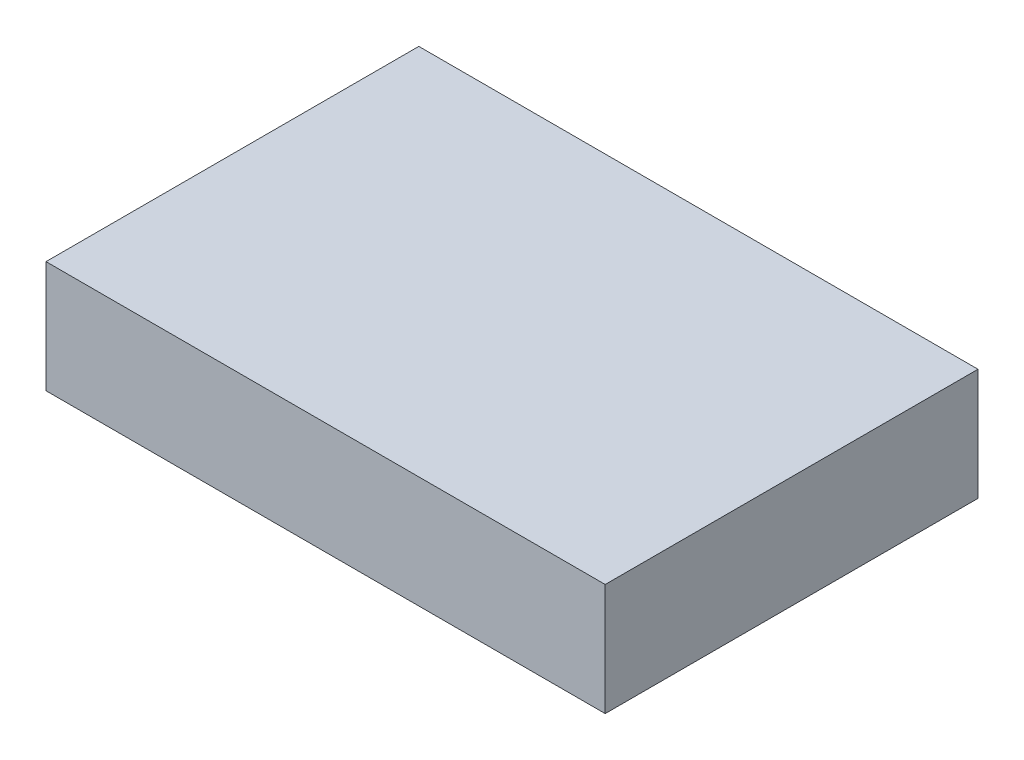
ISO-10303-21;
HEADER;
FILE_DESCRIPTION(('STEP AP214'),'2;1');
FILE_NAME('part.step','',(''),(''),'','','');
FILE_SCHEMA(('AUTOMOTIVE_DESIGN { 1 0 10303 214 1 1 1 1 }'));
ENDSEC;
DATA;
#1=APPLICATION_CONTEXT('core data for automotive mechanical design processes');
#2=APPLICATION_PROTOCOL_DEFINITION('international standard','automotive_design',2000,#1);
#3=PRODUCT_CONTEXT('',#1,'mechanical');
#4=PRODUCT('Part','Part','',(#3));
#5=PRODUCT_RELATED_PRODUCT_CATEGORY('part','',(#4));
#6=PRODUCT_DEFINITION_FORMATION('','',#4);
#7=PRODUCT_DEFINITION_CONTEXT('part definition',#1,'design');
#8=PRODUCT_DEFINITION('design','',#6,#7);
#9=PRODUCT_DEFINITION_SHAPE('','',#8);
#10=(LENGTH_UNIT() NAMED_UNIT(*) SI_UNIT(.MILLI.,.METRE.));
#11=(NAMED_UNIT(*) PLANE_ANGLE_UNIT() SI_UNIT($,.RADIAN.));
#12=(NAMED_UNIT(*) SI_UNIT($,.STERADIAN.) SOLID_ANGLE_UNIT());
#13=UNCERTAINTY_MEASURE_WITH_UNIT(LENGTH_MEASURE(1.E-05),#10,'distance_accuracy_value','');
#14=(GEOMETRIC_REPRESENTATION_CONTEXT(3) GLOBAL_UNCERTAINTY_ASSIGNED_CONTEXT((#13)) GLOBAL_UNIT_ASSIGNED_CONTEXT((#10,
#11,#12)) REPRESENTATION_CONTEXT('',''));
#15=CARTESIAN_POINT('',(0.,0.,0.));
#16=DIRECTION('',(0.,0.,1.));
#17=DIRECTION('',(1.,0.,0.));
#18=AXIS2_PLACEMENT_3D('',#15,#16,#17);
#19=CARTESIAN_POINT('',(0.,12.,0.));
#20=DIRECTION('',(1.,0.,0.));
#21=DIRECTION('',(0.,0.,-1.));
#22=AXIS2_PLACEMENT_3D('',#19,#20,#21);
#23=PLANE('',#22);
#24=DIRECTION('',(0.,0.,1.));
#25=VECTOR('',#24,1.);
#26=CARTESIAN_POINT('',(0.,0.,0.));
#27=LINE('',#26,#25);
#28=CARTESIAN_POINT('',(0.,0.,-40.));
#29=VERTEX_POINT('',#28);
#30=CARTESIAN_POINT('',(0.,0.,0.));
#31=VERTEX_POINT('',#30);
#32=EDGE_CURVE('E96',#29,#31,#27,.T.);
#33=ORIENTED_EDGE('',*,*,#32,.T.);
#34=DIRECTION('',(0.,-1.,0.));
#35=VECTOR('',#34,1.);
#36=CARTESIAN_POINT('',(0.,12.,0.));
#37=LINE('',#36,#35);
#38=CARTESIAN_POINT('',(0.,12.,0.));
#39=VERTEX_POINT('',#38);
#40=EDGE_CURVE('E11',#39,#31,#37,.T.);
#41=ORIENTED_EDGE('',*,*,#40,.F.);
#42=DIRECTION('',(0.,0.,1.));
#43=VECTOR('',#42,1.);
#44=CARTESIAN_POINT('',(0.,12.,0.));
#45=LINE('',#44,#43);
#46=CARTESIAN_POINT('',(0.,12.,-40.));
#47=VERTEX_POINT('',#46);
#48=EDGE_CURVE('E84',#47,#39,#45,.T.);
#49=ORIENTED_EDGE('',*,*,#48,.F.);
#50=DIRECTION('',(0.,-1.,0.));
#51=VECTOR('',#50,1.);
#52=CARTESIAN_POINT('',(0.,12.,-40.));
#53=LINE('',#52,#51);
#54=EDGE_CURVE('E92',#47,#29,#53,.T.);
#55=ORIENTED_EDGE('',*,*,#54,.T.);
#56=EDGE_LOOP('',(#33,#41,#49,#55));
#57=FACE_BOUND('',#56,.T.);
#58=ADVANCED_FACE('F33',(#57),#23,.F.);
#59=CARTESIAN_POINT('',(0.,12.,0.));
#60=DIRECTION('',(0.,0.,-1.));
#61=DIRECTION('',(-1.,0.,0.));
#62=AXIS2_PLACEMENT_3D('',#59,#60,#61);
#63=PLANE('',#62);
#64=DIRECTION('',(1.,0.,0.));
#65=VECTOR('',#64,1.);
#66=CARTESIAN_POINT('',(0.,0.,0.));
#67=LINE('',#66,#65);
#68=CARTESIAN_POINT('',(60.,0.,0.));
#69=VERTEX_POINT('',#68);
#70=EDGE_CURVE('E88',#31,#69,#67,.T.);
#71=ORIENTED_EDGE('',*,*,#70,.T.);
#72=DIRECTION('',(0.,-1.,0.));
#73=VECTOR('',#72,1.);
#74=CARTESIAN_POINT('',(60.,12.,0.));
#75=LINE('',#74,#73);
#76=CARTESIAN_POINT('',(60.,12.,0.));
#77=VERTEX_POINT('',#76);
#78=EDGE_CURVE('E41',#77,#69,#75,.T.);
#79=ORIENTED_EDGE('',*,*,#78,.F.);
#80=DIRECTION('',(1.,0.,0.));
#81=VECTOR('',#80,1.);
#82=CARTESIAN_POINT('',(0.,12.,0.));
#83=LINE('',#82,#81);
#84=EDGE_CURVE('E79',#39,#77,#83,.T.);
#85=ORIENTED_EDGE('',*,*,#84,.F.);
#86=ORIENTED_EDGE('',*,*,#40,.T.);
#87=EDGE_LOOP('',(#71,#79,#85,#86));
#88=FACE_BOUND('',#87,.T.);
#89=ADVANCED_FACE('F87',(#88),#63,.F.);
#90=CARTESIAN_POINT('',(60.,12.,0.));
#91=DIRECTION('',(-1.,0.,0.));
#92=DIRECTION('',(0.,0.,1.));
#93=AXIS2_PLACEMENT_3D('',#90,#91,#92);
#94=PLANE('',#93);
#95=DIRECTION('',(0.,0.,-1.));
#96=VECTOR('',#95,1.);
#97=CARTESIAN_POINT('',(60.,0.,0.));
#98=LINE('',#97,#96);
#99=CARTESIAN_POINT('',(60.,0.,-40.));
#100=VERTEX_POINT('',#99);
#101=EDGE_CURVE('E66',#69,#100,#98,.T.);
#102=ORIENTED_EDGE('',*,*,#101,.T.);
#103=DIRECTION('',(0.,-1.,0.));
#104=VECTOR('',#103,1.);
#105=CARTESIAN_POINT('',(60.,12.,-40.));
#106=LINE('',#105,#104);
#107=CARTESIAN_POINT('',(60.,12.,-40.));
#108=VERTEX_POINT('',#107);
#109=EDGE_CURVE('E89',#108,#100,#106,.T.);
#110=ORIENTED_EDGE('',*,*,#109,.F.);
#111=DIRECTION('',(0.,0.,-1.));
#112=VECTOR('',#111,1.);
#113=CARTESIAN_POINT('',(60.,12.,0.));
#114=LINE('',#113,#112);
#115=EDGE_CURVE('E82',#77,#108,#114,.T.);
#116=ORIENTED_EDGE('',*,*,#115,.F.);
#117=ORIENTED_EDGE('',*,*,#78,.T.);
#118=EDGE_LOOP('',(#102,#110,#116,#117));
#119=FACE_BOUND('',#118,.T.);
#120=ADVANCED_FACE('F90',(#119),#94,.F.);
#121=CARTESIAN_POINT('',(0.,12.,-40.));
#122=DIRECTION('',(0.,0.,1.));
#123=DIRECTION('',(1.,0.,0.));
#124=AXIS2_PLACEMENT_3D('',#121,#122,#123);
#125=PLANE('',#124);
#126=DIRECTION('',(-1.,0.,0.));
#127=VECTOR('',#126,1.);
#128=CARTESIAN_POINT('',(0.,0.,-40.));
#129=LINE('',#128,#127);
#130=EDGE_CURVE('E72',#100,#29,#129,.T.);
#131=ORIENTED_EDGE('',*,*,#130,.T.);
#132=ORIENTED_EDGE('',*,*,#54,.F.);
#133=DIRECTION('',(-1.,0.,0.));
#134=VECTOR('',#133,1.);
#135=CARTESIAN_POINT('',(0.,12.,-40.));
#136=LINE('',#135,#134);
#137=EDGE_CURVE('E49',#108,#47,#136,.T.);
#138=ORIENTED_EDGE('',*,*,#137,.F.);
#139=ORIENTED_EDGE('',*,*,#109,.T.);
#140=EDGE_LOOP('',(#131,#132,#138,#139));
#141=FACE_BOUND('',#140,.T.);
#142=ADVANCED_FACE('F103',(#141),#125,.F.);
#143=CARTESIAN_POINT('',(0.,12.,0.));
#144=DIRECTION('',(0.,-1.,0.));
#145=DIRECTION('',(0.,0.,-1.));
#146=AXIS2_PLACEMENT_3D('',#143,#144,#145);
#147=PLANE('',#146);
#148=ORIENTED_EDGE('',*,*,#48,.T.);
#149=ORIENTED_EDGE('',*,*,#84,.T.);
#150=ORIENTED_EDGE('',*,*,#115,.T.);
#151=ORIENTED_EDGE('',*,*,#137,.T.);
#152=EDGE_LOOP('',(#148,#149,#150,#151));
#153=FACE_BOUND('',#152,.T.);
#154=ADVANCED_FACE('F80',(#153),#147,.F.);
#155=CARTESIAN_POINT('',(0.,0.,0.));
#156=DIRECTION('',(0.,-1.,0.));
#157=DIRECTION('',(0.,0.,-1.));
#158=AXIS2_PLACEMENT_3D('',#155,#156,#157);
#159=PLANE('',#158);
#160=ORIENTED_EDGE('',*,*,#32,.F.);
#161=ORIENTED_EDGE('',*,*,#130,.F.);
#162=ORIENTED_EDGE('',*,*,#101,.F.);
#163=ORIENTED_EDGE('',*,*,#70,.F.);
#164=EDGE_LOOP('',(#160,#161,#162,#163));
#165=FACE_BOUND('',#164,.T.);
#166=ADVANCED_FACE('F106',(#165),#159,.T.);
#167=CLOSED_SHELL('',(#58,#89,#120,#142,#154,#166));
#168=MANIFOLD_SOLID_BREP('B2',#167);
#169=ADVANCED_BREP_SHAPE_REPRESENTATION('',(#18,#168),#14);
#170=SHAPE_DEFINITION_REPRESENTATION(#9,#169);
ENDSEC;
END-ISO-10303-21;
